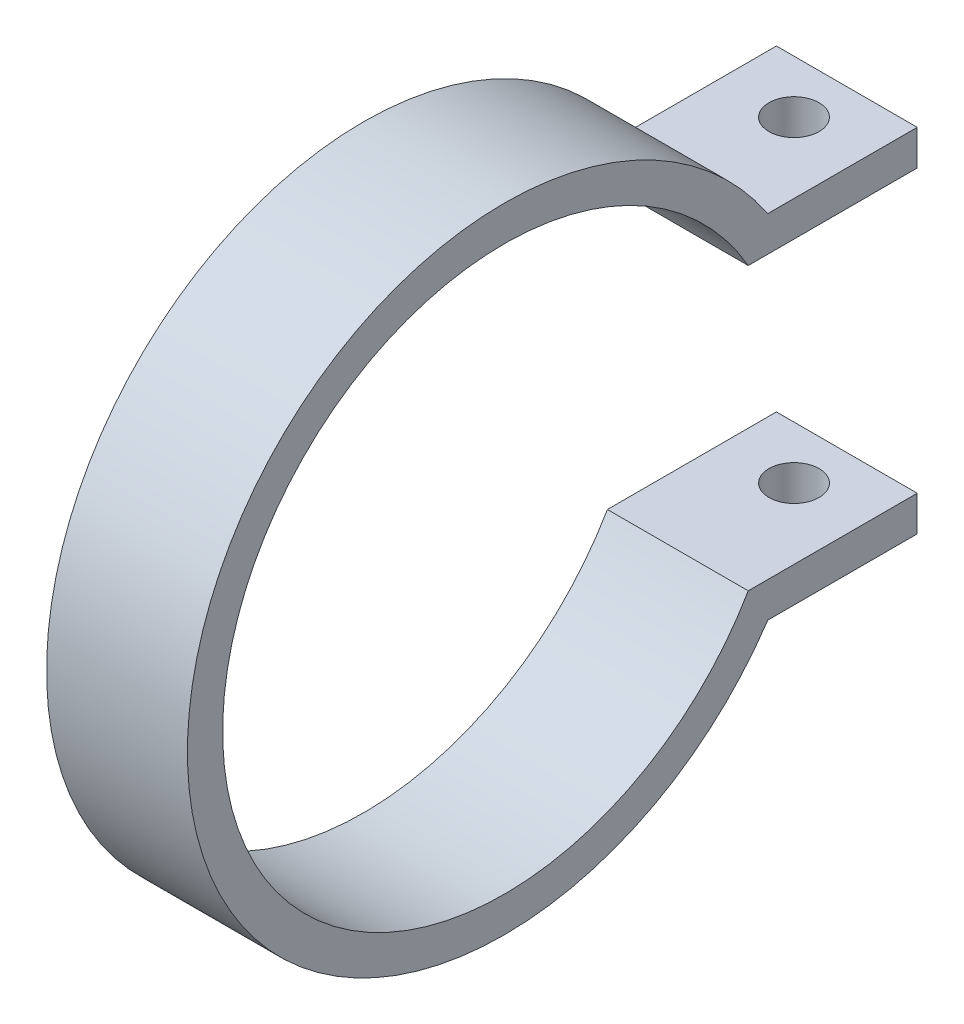
ISO-10303-21;
HEADER;
FILE_DESCRIPTION(('STEP AP214'),'2;1');
FILE_NAME('part.step','',(''),(''),'','','');
FILE_SCHEMA(('AUTOMOTIVE_DESIGN { 1 0 10303 214 1 1 1 1 }'));
ENDSEC;
DATA;
#1=APPLICATION_CONTEXT('core data for automotive mechanical design processes');
#2=APPLICATION_PROTOCOL_DEFINITION('international standard','automotive_design',2000,#1);
#3=PRODUCT_CONTEXT('',#1,'mechanical');
#4=PRODUCT('Part','Part','',(#3));
#5=PRODUCT_RELATED_PRODUCT_CATEGORY('part','',(#4));
#6=PRODUCT_DEFINITION_FORMATION('','',#4);
#7=PRODUCT_DEFINITION_CONTEXT('part definition',#1,'design');
#8=PRODUCT_DEFINITION('design','',#6,#7);
#9=PRODUCT_DEFINITION_SHAPE('','',#8);
#10=(LENGTH_UNIT() NAMED_UNIT(*) SI_UNIT(.MILLI.,.METRE.));
#11=(NAMED_UNIT(*) PLANE_ANGLE_UNIT() SI_UNIT($,.RADIAN.));
#12=(NAMED_UNIT(*) SI_UNIT($,.STERADIAN.) SOLID_ANGLE_UNIT());
#13=UNCERTAINTY_MEASURE_WITH_UNIT(LENGTH_MEASURE(1.E-05),#10,'distance_accuracy_value','');
#14=(GEOMETRIC_REPRESENTATION_CONTEXT(3) GLOBAL_UNCERTAINTY_ASSIGNED_CONTEXT((#13)) GLOBAL_UNIT_ASSIGNED_CONTEXT((#10,
#11,#12)) REPRESENTATION_CONTEXT('',''));
#15=CARTESIAN_POINT('',(0.,0.,0.));
#16=DIRECTION('',(0.,0.,1.));
#17=DIRECTION('',(1.,0.,0.));
#18=AXIS2_PLACEMENT_3D('',#15,#16,#17);
#19=CARTESIAN_POINT('',(6.35,0.,0.));
#20=DIRECTION('',(-1.,0.,0.));
#21=DIRECTION('',(0.,0.,1.));
#22=AXIS2_PLACEMENT_3D('',#19,#20,#21);
#23=CYLINDRICAL_SURFACE('',#22,12.7);
#24=CARTESIAN_POINT('',(0.,0.,0.));
#25=DIRECTION('',(-1.,0.,0.));
#26=DIRECTION('',(0.,0.,-1.));
#27=AXIS2_PLACEMENT_3D('',#24,#25,#26);
#28=CIRCLE('',#27,12.7);
#29=CARTESIAN_POINT('',(0.,-6.35,-10.9985226280624));
#30=VERTEX_POINT('',#29);
#31=CARTESIAN_POINT('',(0.,6.35,-10.9985226280624));
#32=VERTEX_POINT('',#31);
#33=EDGE_CURVE('E150',#30,#32,#28,.T.);
#34=ORIENTED_EDGE('',*,*,#33,.T.);
#35=DIRECTION('',(-1.,0.,0.));
#36=VECTOR('',#35,1.);
#37=CARTESIAN_POINT('',(6.35,6.35,-10.9985226280624));
#38=LINE('',#37,#36);
#39=CARTESIAN_POINT('',(6.35,6.35,-10.9985226280624));
#40=VERTEX_POINT('',#39);
#41=EDGE_CURVE('E11',#40,#32,#38,.T.);
#42=ORIENTED_EDGE('',*,*,#41,.F.);
#43=CARTESIAN_POINT('',(6.35,0.,0.));
#44=DIRECTION('',(-1.,0.,0.));
#45=DIRECTION('',(0.,0.,-1.));
#46=AXIS2_PLACEMENT_3D('',#43,#44,#45);
#47=CIRCLE('',#46,12.7);
#48=CARTESIAN_POINT('',(6.35,-6.35,-10.9985226280624));
#49=VERTEX_POINT('',#48);
#50=EDGE_CURVE('E173',#49,#40,#47,.T.);
#51=ORIENTED_EDGE('',*,*,#50,.F.);
#52=DIRECTION('',(-1.,0.,0.));
#53=VECTOR('',#52,1.);
#54=CARTESIAN_POINT('',(6.35,-6.35,-10.9985226280624));
#55=LINE('',#54,#53);
#56=EDGE_CURVE('E146',#49,#30,#55,.T.);
#57=ORIENTED_EDGE('',*,*,#56,.T.);
#58=EDGE_LOOP('',(#34,#42,#51,#57));
#59=FACE_BOUND('',#58,.T.);
#60=ADVANCED_FACE('F47',(#59),#23,.F.);
#61=CARTESIAN_POINT('',(6.35,6.35,-10.9985226280624));
#62=DIRECTION('',(0.,1.,0.));
#63=DIRECTION('',(0.,0.,1.));
#64=AXIS2_PLACEMENT_3D('',#61,#62,#63);
#65=PLANE('',#64);
#66=CARTESIAN_POINT('',(3.175,6.35,-16.2372726280624));
#67=DIRECTION('',(0.,1.,0.));
#68=DIRECTION('',(0.,0.,1.));
#69=AXIS2_PLACEMENT_3D('',#66,#67,#68);
#70=CIRCLE('',#69,1.1303);
#71=CARTESIAN_POINT('',(3.175,6.35,-15.1069726280624));
#72=VERTEX_POINT('',#71);
#73=EDGE_CURVE('E155',#72,#72,#70,.T.);
#74=ORIENTED_EDGE('',*,*,#73,.T.);
#75=EDGE_LOOP('',(#74));
#76=FACE_BOUND('',#75,.T.);
#77=DIRECTION('',(0.,0.,-1.));
#78=VECTOR('',#77,1.);
#79=CARTESIAN_POINT('',(0.,6.35,-10.9985226280624));
#80=LINE('',#79,#78);
#81=CARTESIAN_POINT('',(0.,6.35,-18.6185226280624));
#82=VERTEX_POINT('',#81);
#83=EDGE_CURVE('E154',#32,#82,#80,.T.);
#84=ORIENTED_EDGE('',*,*,#83,.T.);
#85=DIRECTION('',(-1.,0.,0.));
#86=VECTOR('',#85,1.);
#87=CARTESIAN_POINT('',(6.35,6.35,-18.6185226280624));
#88=LINE('',#87,#86);
#89=CARTESIAN_POINT('',(6.35,6.35,-18.6185226280624));
#90=VERTEX_POINT('',#89);
#91=EDGE_CURVE('E56',#90,#82,#88,.T.);
#92=ORIENTED_EDGE('',*,*,#91,.F.);
#93=DIRECTION('',(0.,0.,-1.));
#94=VECTOR('',#93,1.);
#95=CARTESIAN_POINT('',(6.35,6.35,-10.9985226280624));
#96=LINE('',#95,#94);
#97=EDGE_CURVE('E107',#40,#90,#96,.T.);
#98=ORIENTED_EDGE('',*,*,#97,.F.);
#99=ORIENTED_EDGE('',*,*,#41,.T.);
#100=EDGE_LOOP('',(#84,#92,#98,#99));
#101=FACE_BOUND('',#100,.T.);
#102=ADVANCED_FACE('F254',(#76,#101),#65,.F.);
#103=CARTESIAN_POINT('',(6.35,6.35,-18.6185226280624));
#104=DIRECTION('',(0.,0.,1.));
#105=DIRECTION('',(1.,0.,0.));
#106=AXIS2_PLACEMENT_3D('',#103,#104,#105);
#107=PLANE('',#106);
#108=DIRECTION('',(0.,1.,0.));
#109=VECTOR('',#108,1.);
#110=CARTESIAN_POINT('',(0.,6.35,-18.6185226280624));
#111=LINE('',#110,#109);
#112=CARTESIAN_POINT('',(0.,7.9375,-18.6185226280624));
#113=VERTEX_POINT('',#112);
#114=EDGE_CURVE('E158',#82,#113,#111,.T.);
#115=ORIENTED_EDGE('',*,*,#114,.T.);
#116=DIRECTION('',(-1.,0.,0.));
#117=VECTOR('',#116,1.);
#118=CARTESIAN_POINT('',(6.35,7.9375,-18.6185226280624));
#119=LINE('',#118,#117);
#120=CARTESIAN_POINT('',(6.35,7.9375,-18.6185226280624));
#121=VERTEX_POINT('',#120);
#122=EDGE_CURVE('E184',#121,#113,#119,.T.);
#123=ORIENTED_EDGE('',*,*,#122,.F.);
#124=DIRECTION('',(0.,1.,0.));
#125=VECTOR('',#124,1.);
#126=CARTESIAN_POINT('',(6.35,6.35,-18.6185226280624));
#127=LINE('',#126,#125);
#128=EDGE_CURVE('E196',#90,#121,#127,.T.);
#129=ORIENTED_EDGE('',*,*,#128,.F.);
#130=ORIENTED_EDGE('',*,*,#91,.T.);
#131=EDGE_LOOP('',(#115,#123,#129,#130));
#132=FACE_BOUND('',#131,.T.);
#133=ADVANCED_FACE('F194',(#132),#107,.F.);
#134=CARTESIAN_POINT('',(6.35,7.9375,-18.6185226280624));
#135=DIRECTION('',(0.,-1.,0.));
#136=DIRECTION('',(0.,0.,-1.));
#137=AXIS2_PLACEMENT_3D('',#134,#135,#136);
#138=PLANE('',#137);
#139=CARTESIAN_POINT('',(3.175,7.9375,-16.2372726280624));
#140=DIRECTION('',(0.,-1.,0.));
#141=DIRECTION('',(0.,0.,-1.));
#142=AXIS2_PLACEMENT_3D('',#139,#140,#141);
#143=CIRCLE('',#142,1.1303);
#144=CARTESIAN_POINT('',(3.175,7.9375,-17.3675726280624));
#145=VERTEX_POINT('',#144);
#146=EDGE_CURVE('E224',#145,#145,#143,.T.);
#147=ORIENTED_EDGE('',*,*,#146,.T.);
#148=EDGE_LOOP('',(#147));
#149=FACE_BOUND('',#148,.T.);
#150=DIRECTION('',(0.,0.,1.));
#151=VECTOR('',#150,1.);
#152=CARTESIAN_POINT('',(0.,7.9375,-18.6185226280624));
#153=LINE('',#152,#151);
#154=CARTESIAN_POINT('',(0.,7.9375,-11.8797622030073));
#155=VERTEX_POINT('',#154);
#156=EDGE_CURVE('E161',#113,#155,#153,.T.);
#157=ORIENTED_EDGE('',*,*,#156,.T.);
#158=DIRECTION('',(-1.,0.,0.));
#159=VECTOR('',#158,1.);
#160=CARTESIAN_POINT('',(6.35,7.9375,-11.8797622030073));
#161=LINE('',#160,#159);
#162=CARTESIAN_POINT('',(6.35,7.9375,-11.8797622030073));
#163=VERTEX_POINT('',#162);
#164=EDGE_CURVE('E180',#163,#155,#161,.T.);
#165=ORIENTED_EDGE('',*,*,#164,.F.);
#166=DIRECTION('',(0.,0.,1.));
#167=VECTOR('',#166,1.);
#168=CARTESIAN_POINT('',(6.35,7.9375,-18.6185226280624));
#169=LINE('',#168,#167);
#170=EDGE_CURVE('E209',#121,#163,#169,.T.);
#171=ORIENTED_EDGE('',*,*,#170,.F.);
#172=ORIENTED_EDGE('',*,*,#122,.T.);
#173=EDGE_LOOP('',(#157,#165,#171,#172));
#174=FACE_BOUND('',#173,.T.);
#175=ADVANCED_FACE('F204',(#149,#174),#138,.F.);
#176=CARTESIAN_POINT('',(6.35,0.,0.));
#177=DIRECTION('',(-1.,0.,0.));
#178=DIRECTION('',(0.,0.,1.));
#179=AXIS2_PLACEMENT_3D('',#176,#177,#178);
#180=CYLINDRICAL_SURFACE('',#179,14.2875);
#181=CARTESIAN_POINT('',(0.,0.,0.));
#182=DIRECTION('',(1.,0.,0.));
#183=DIRECTION('',(0.,0.,-1.));
#184=AXIS2_PLACEMENT_3D('',#181,#182,#183);
#185=CIRCLE('',#184,14.2875);
#186=CARTESIAN_POINT('',(0.,-7.9375,-11.8797622030073));
#187=VERTEX_POINT('',#186);
#188=EDGE_CURVE('E164',#155,#187,#185,.T.);
#189=ORIENTED_EDGE('',*,*,#188,.T.);
#190=DIRECTION('',(-1.,0.,0.));
#191=VECTOR('',#190,1.);
#192=CARTESIAN_POINT('',(6.35,-7.9375,-11.8797622030073));
#193=LINE('',#192,#191);
#194=CARTESIAN_POINT('',(6.35,-7.9375,-11.8797622030073));
#195=VERTEX_POINT('',#194);
#196=EDGE_CURVE('E137',#195,#187,#193,.T.);
#197=ORIENTED_EDGE('',*,*,#196,.F.);
#198=CARTESIAN_POINT('',(6.35,0.,0.));
#199=DIRECTION('',(1.,0.,0.));
#200=DIRECTION('',(0.,0.,-1.));
#201=AXIS2_PLACEMENT_3D('',#198,#199,#200);
#202=CIRCLE('',#201,14.2875);
#203=EDGE_CURVE('E126',#163,#195,#202,.T.);
#204=ORIENTED_EDGE('',*,*,#203,.F.);
#205=ORIENTED_EDGE('',*,*,#164,.T.);
#206=EDGE_LOOP('',(#189,#197,#204,#205));
#207=FACE_BOUND('',#206,.T.);
#208=ADVANCED_FACE('F207',(#207),#180,.T.);
#209=CARTESIAN_POINT('',(6.35,-7.9375,-11.8797622030073));
#210=DIRECTION('',(0.,1.,0.));
#211=DIRECTION('',(0.,0.,1.));
#212=AXIS2_PLACEMENT_3D('',#209,#210,#211);
#213=PLANE('',#212);
#214=CARTESIAN_POINT('',(3.175,-7.9375,-16.2372726280624));
#215=DIRECTION('',(0.,-1.,0.));
#216=DIRECTION('',(0.,0.,-1.));
#217=AXIS2_PLACEMENT_3D('',#214,#215,#216);
#218=CIRCLE('',#217,1.1303);
#219=CARTESIAN_POINT('',(3.175,-7.9375,-17.3675726280624));
#220=VERTEX_POINT('',#219);
#221=EDGE_CURVE('E232',#220,#220,#218,.T.);
#222=ORIENTED_EDGE('',*,*,#221,.F.);
#223=EDGE_LOOP('',(#222));
#224=FACE_BOUND('',#223,.T.);
#225=DIRECTION('',(0.,0.,-1.));
#226=VECTOR('',#225,1.);
#227=CARTESIAN_POINT('',(0.,-7.9375,-11.8797622030073));
#228=LINE('',#227,#226);
#229=CARTESIAN_POINT('',(0.,-7.9375,-18.6185226280624));
#230=VERTEX_POINT('',#229);
#231=EDGE_CURVE('E135',#187,#230,#228,.T.);
#232=ORIENTED_EDGE('',*,*,#231,.T.);
#233=DIRECTION('',(-1.,0.,0.));
#234=VECTOR('',#233,1.);
#235=CARTESIAN_POINT('',(6.35,-7.9375,-18.6185226280624));
#236=LINE('',#235,#234);
#237=CARTESIAN_POINT('',(6.35,-7.9375,-18.6185226280624));
#238=VERTEX_POINT('',#237);
#239=EDGE_CURVE('E132',#238,#230,#236,.T.);
#240=ORIENTED_EDGE('',*,*,#239,.F.);
#241=DIRECTION('',(0.,0.,-1.));
#242=VECTOR('',#241,1.);
#243=CARTESIAN_POINT('',(6.35,-7.9375,-11.8797622030073));
#244=LINE('',#243,#242);
#245=EDGE_CURVE('E120',#195,#238,#244,.T.);
#246=ORIENTED_EDGE('',*,*,#245,.F.);
#247=ORIENTED_EDGE('',*,*,#196,.T.);
#248=EDGE_LOOP('',(#232,#240,#246,#247));
#249=FACE_BOUND('',#248,.T.);
#250=ADVANCED_FACE('F133',(#224,#249),#213,.F.);
#251=CARTESIAN_POINT('',(6.35,-7.9375,-18.6185226280624));
#252=DIRECTION('',(0.,0.,1.));
#253=DIRECTION('',(1.,0.,0.));
#254=AXIS2_PLACEMENT_3D('',#251,#252,#253);
#255=PLANE('',#254);
#256=DIRECTION('',(0.,1.,0.));
#257=VECTOR('',#256,1.);
#258=CARTESIAN_POINT('',(0.,-7.9375,-18.6185226280624));
#259=LINE('',#258,#257);
#260=CARTESIAN_POINT('',(0.,-6.35,-18.6185226280624));
#261=VERTEX_POINT('',#260);
#262=EDGE_CURVE('E93',#230,#261,#259,.T.);
#263=ORIENTED_EDGE('',*,*,#262,.T.);
#264=DIRECTION('',(-1.,0.,0.));
#265=VECTOR('',#264,1.);
#266=CARTESIAN_POINT('',(6.35,-6.35,-18.6185226280624));
#267=LINE('',#266,#265);
#268=CARTESIAN_POINT('',(6.35,-6.35,-18.6185226280624));
#269=VERTEX_POINT('',#268);
#270=EDGE_CURVE('E138',#269,#261,#267,.T.);
#271=ORIENTED_EDGE('',*,*,#270,.F.);
#272=DIRECTION('',(0.,1.,0.));
#273=VECTOR('',#272,1.);
#274=CARTESIAN_POINT('',(6.35,-7.9375,-18.6185226280624));
#275=LINE('',#274,#273);
#276=EDGE_CURVE('E124',#238,#269,#275,.T.);
#277=ORIENTED_EDGE('',*,*,#276,.F.);
#278=ORIENTED_EDGE('',*,*,#239,.T.);
#279=EDGE_LOOP('',(#263,#271,#277,#278));
#280=FACE_BOUND('',#279,.T.);
#281=ADVANCED_FACE('F140',(#280),#255,.F.);
#282=CARTESIAN_POINT('',(6.35,-6.35,-10.9985226280624));
#283=DIRECTION('',(0.,-1.,0.));
#284=DIRECTION('',(0.,0.,-1.));
#285=AXIS2_PLACEMENT_3D('',#282,#283,#284);
#286=PLANE('',#285);
#287=CARTESIAN_POINT('',(3.175,-6.35,-16.2372726280624));
#288=DIRECTION('',(0.,-1.,0.));
#289=DIRECTION('',(0.,0.,-1.));
#290=AXIS2_PLACEMENT_3D('',#287,#288,#289);
#291=CIRCLE('',#290,1.1303);
#292=CARTESIAN_POINT('',(3.175,-6.35,-17.3675726280624));
#293=VERTEX_POINT('',#292);
#294=EDGE_CURVE('E228',#293,#293,#291,.T.);
#295=ORIENTED_EDGE('',*,*,#294,.T.);
#296=EDGE_LOOP('',(#295));
#297=FACE_BOUND('',#296,.T.);
#298=DIRECTION('',(0.,0.,1.));
#299=VECTOR('',#298,1.);
#300=CARTESIAN_POINT('',(0.,-6.35,-10.9985226280624));
#301=LINE('',#300,#299);
#302=EDGE_CURVE('E99',#261,#30,#301,.T.);
#303=ORIENTED_EDGE('',*,*,#302,.T.);
#304=ORIENTED_EDGE('',*,*,#56,.F.);
#305=DIRECTION('',(0.,0.,1.));
#306=VECTOR('',#305,1.);
#307=CARTESIAN_POINT('',(6.35,-6.35,-10.9985226280624));
#308=LINE('',#307,#306);
#309=EDGE_CURVE('E64',#269,#49,#308,.T.);
#310=ORIENTED_EDGE('',*,*,#309,.F.);
#311=ORIENTED_EDGE('',*,*,#270,.T.);
#312=EDGE_LOOP('',(#303,#304,#310,#311));
#313=FACE_BOUND('',#312,.T.);
#314=ADVANCED_FACE('F249',(#297,#313),#286,.F.);
#315=CARTESIAN_POINT('',(6.35,0.,0.));
#316=DIRECTION('',(1.,0.,0.));
#317=DIRECTION('',(0.,0.,-1.));
#318=AXIS2_PLACEMENT_3D('',#315,#316,#317);
#319=PLANE('',#318);
#320=ORIENTED_EDGE('',*,*,#50,.T.);
#321=ORIENTED_EDGE('',*,*,#97,.T.);
#322=ORIENTED_EDGE('',*,*,#128,.T.);
#323=ORIENTED_EDGE('',*,*,#170,.T.);
#324=ORIENTED_EDGE('',*,*,#203,.T.);
#325=ORIENTED_EDGE('',*,*,#245,.T.);
#326=ORIENTED_EDGE('',*,*,#276,.T.);
#327=ORIENTED_EDGE('',*,*,#309,.T.);
#328=EDGE_LOOP('',(#320,#321,#322,#323,#324,#325,#326,#327));
#329=FACE_BOUND('',#328,.T.);
#330=ADVANCED_FACE('F122',(#329),#319,.T.);
#331=CARTESIAN_POINT('',(0.,0.,0.));
#332=DIRECTION('',(1.,0.,0.));
#333=DIRECTION('',(0.,0.,-1.));
#334=AXIS2_PLACEMENT_3D('',#331,#332,#333);
#335=PLANE('',#334);
#336=ORIENTED_EDGE('',*,*,#33,.F.);
#337=ORIENTED_EDGE('',*,*,#302,.F.);
#338=ORIENTED_EDGE('',*,*,#262,.F.);
#339=ORIENTED_EDGE('',*,*,#231,.F.);
#340=ORIENTED_EDGE('',*,*,#188,.F.);
#341=ORIENTED_EDGE('',*,*,#156,.F.);
#342=ORIENTED_EDGE('',*,*,#114,.F.);
#343=ORIENTED_EDGE('',*,*,#83,.F.);
#344=EDGE_LOOP('',(#336,#337,#338,#339,#340,#341,#342,#343));
#345=FACE_BOUND('',#344,.T.);
#346=ADVANCED_FACE('F200',(#345),#335,.F.);
#347=CARTESIAN_POINT('',(3.175,-7.9375,-16.2372726280624));
#348=DIRECTION('',(0.,-1.,0.));
#349=DIRECTION('',(0.,0.,-1.));
#350=AXIS2_PLACEMENT_3D('',#347,#348,#349);
#351=CYLINDRICAL_SURFACE('',#350,1.1303);
#352=ORIENTED_EDGE('',*,*,#221,.T.);
#353=EDGE_LOOP('',(#352));
#354=FACE_BOUND('',#353,.T.);
#355=ORIENTED_EDGE('',*,*,#294,.F.);
#356=EDGE_LOOP('',(#355));
#357=FACE_BOUND('',#356,.T.);
#358=ADVANCED_FACE('F239',(#354,#357),#351,.F.);
#359=ORIENTED_EDGE('',*,*,#146,.F.);
#360=EDGE_LOOP('',(#359));
#361=FACE_BOUND('',#360,.T.);
#362=ORIENTED_EDGE('',*,*,#73,.F.);
#363=EDGE_LOOP('',(#362));
#364=FACE_BOUND('',#363,.T.);
#365=ADVANCED_FACE('F273',(#361,#364),#351,.F.);
#366=CLOSED_SHELL('',(#60,#102,#133,#175,#208,#250,#281,#314,#330,#346,#358,#365));
#367=MANIFOLD_SOLID_BREP('B2',#366);
#368=ADVANCED_BREP_SHAPE_REPRESENTATION('',(#18,#367),#14);
#369=SHAPE_DEFINITION_REPRESENTATION(#9,#368);
ENDSEC;
END-ISO-10303-21;
